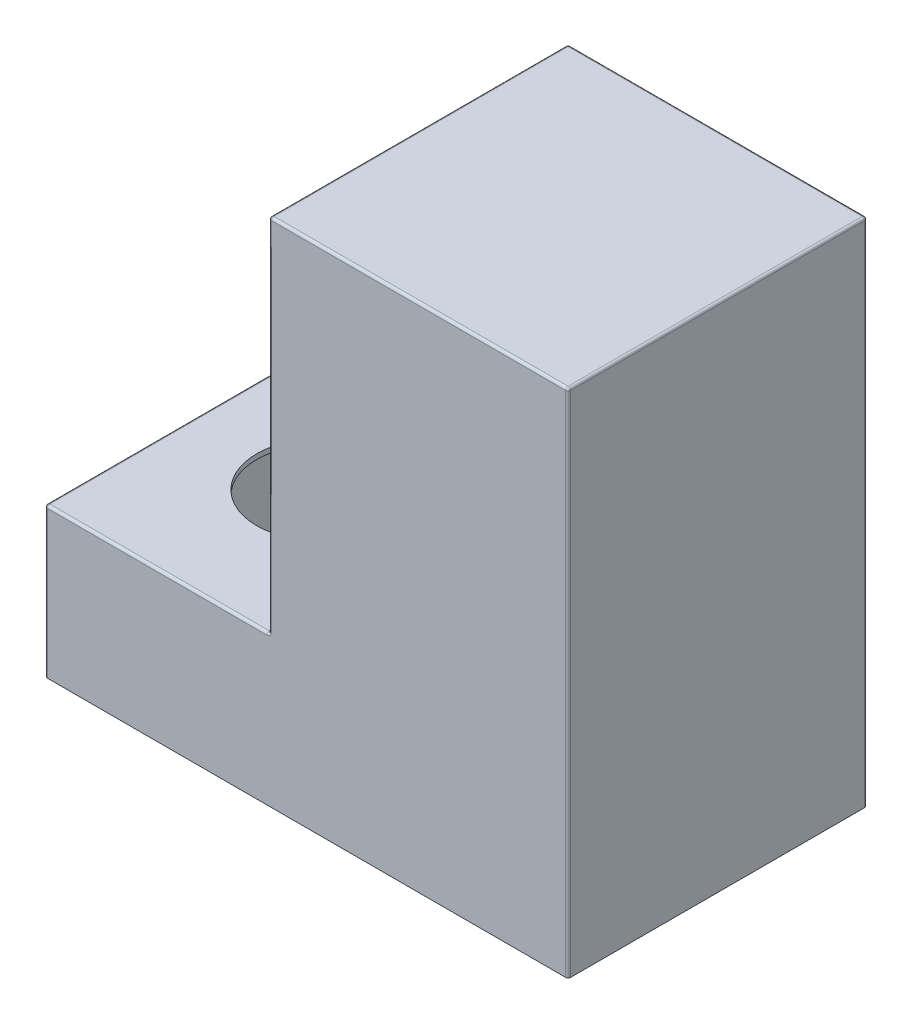
ISO-10303-21;
HEADER;
FILE_DESCRIPTION(('STEP AP214'),'2;1');
FILE_NAME('part.step','',(''),(''),'','','');
FILE_SCHEMA(('AUTOMOTIVE_DESIGN { 1 0 10303 214 1 1 1 1 }'));
ENDSEC;
DATA;
#1=APPLICATION_CONTEXT('core data for automotive mechanical design processes');
#2=APPLICATION_PROTOCOL_DEFINITION('international standard','automotive_design',2000,#1);
#3=PRODUCT_CONTEXT('',#1,'mechanical');
#4=PRODUCT('Part','Part','',(#3));
#5=PRODUCT_RELATED_PRODUCT_CATEGORY('part','',(#4));
#6=PRODUCT_DEFINITION_FORMATION('','',#4);
#7=PRODUCT_DEFINITION_CONTEXT('part definition',#1,'design');
#8=PRODUCT_DEFINITION('design','',#6,#7);
#9=PRODUCT_DEFINITION_SHAPE('','',#8);
#10=(LENGTH_UNIT() NAMED_UNIT(*) SI_UNIT(.MILLI.,.METRE.));
#11=(NAMED_UNIT(*) PLANE_ANGLE_UNIT() SI_UNIT($,.RADIAN.));
#12=(NAMED_UNIT(*) SI_UNIT($,.STERADIAN.) SOLID_ANGLE_UNIT());
#13=UNCERTAINTY_MEASURE_WITH_UNIT(LENGTH_MEASURE(1.E-05),#10,'distance_accuracy_value','');
#14=(GEOMETRIC_REPRESENTATION_CONTEXT(3) GLOBAL_UNCERTAINTY_ASSIGNED_CONTEXT((#13)) GLOBAL_UNIT_ASSIGNED_CONTEXT((#10,
#11,#12)) REPRESENTATION_CONTEXT('',''));
#15=CARTESIAN_POINT('',(0.,0.,0.));
#16=DIRECTION('',(0.,0.,1.));
#17=DIRECTION('',(1.,0.,0.));
#18=AXIS2_PLACEMENT_3D('',#15,#16,#17);
#19=CARTESIAN_POINT('',(-13.,100.5,2.));
#20=DIRECTION('',(-1.,0.,0.));
#21=DIRECTION('',(0.,0.,1.));
#22=AXIS2_PLACEMENT_3D('',#19,#20,#21);
#23=PLANE('',#22);
#24=DIRECTION('',(0.,0.,1.));
#25=VECTOR('',#24,1.);
#26=CARTESIAN_POINT('',(-13.,-44.5,2.));
#27=LINE('',#26,#25);
#28=CARTESIAN_POINT('',(-13.,-44.5,2.));
#29=VERTEX_POINT('',#28);
#30=CARTESIAN_POINT('',(-13.,-44.4999999999999,118.));
#31=VERTEX_POINT('',#30);
#32=EDGE_CURVE('E215',#29,#31,#27,.T.);
#33=ORIENTED_EDGE('',*,*,#32,.F.);
#34=DIRECTION('',(0.,-1.,0.));
#35=VECTOR('',#34,1.);
#36=CARTESIAN_POINT('',(-13.,100.5,2.));
#37=LINE('',#36,#35);
#38=CARTESIAN_POINT('',(-13.,100.5,2.));
#39=VERTEX_POINT('',#38);
#40=EDGE_CURVE('E226',#39,#29,#37,.T.);
#41=ORIENTED_EDGE('',*,*,#40,.F.);
#42=DIRECTION('',(0.,0.,-1.));
#43=VECTOR('',#42,1.);
#44=CARTESIAN_POINT('',(-13.,100.5,2.));
#45=LINE('',#44,#43);
#46=CARTESIAN_POINT('',(-13.,100.5,118.));
#47=VERTEX_POINT('',#46);
#48=EDGE_CURVE('E623',#47,#39,#45,.T.);
#49=ORIENTED_EDGE('',*,*,#48,.F.);
#50=DIRECTION('',(0.,-1.,0.));
#51=VECTOR('',#50,1.);
#52=CARTESIAN_POINT('',(-13.,100.5,118.));
#53=LINE('',#52,#51);
#54=EDGE_CURVE('E228',#47,#31,#53,.T.);
#55=ORIENTED_EDGE('',*,*,#54,.T.);
#56=EDGE_LOOP('',(#33,#41,#49,#55));
#57=FACE_BOUND('',#56,.T.);
#58=ADVANCED_FACE('F46',(#57),#23,.F.);
#59=CARTESIAN_POINT('',(105.,-102.5,120.));
#60=DIRECTION('',(-1.,0.,0.));
#61=DIRECTION('',(0.,0.,1.));
#62=AXIS2_PLACEMENT_3D('',#59,#60,#61);
#63=PLANE('',#62);
#64=DIRECTION('',(0.,1.,0.));
#65=VECTOR('',#64,1.);
#66=CARTESIAN_POINT('',(105.,102.5,1.));
#67=LINE('',#66,#65);
#68=CARTESIAN_POINT('',(105.,-102.5,1.));
#69=VERTEX_POINT('',#68);
#70=CARTESIAN_POINT('',(105.,101.5,1.));
#71=VERTEX_POINT('',#70);
#72=EDGE_CURVE('E375',#69,#71,#67,.T.);
#73=ORIENTED_EDGE('',*,*,#72,.T.);
#74=DIRECTION('',(0.,0.,-1.));
#75=VECTOR('',#74,1.);
#76=CARTESIAN_POINT('',(105.,101.5,120.));
#77=LINE('',#76,#75);
#78=CARTESIAN_POINT('',(105.,101.5,119.));
#79=VERTEX_POINT('',#78);
#80=EDGE_CURVE('E377',#71,#79,#77,.F.);
#81=ORIENTED_EDGE('',*,*,#80,.T.);
#82=DIRECTION('',(0.,1.,0.));
#83=VECTOR('',#82,1.);
#84=CARTESIAN_POINT('',(105.,-102.5,119.));
#85=LINE('',#84,#83);
#86=CARTESIAN_POINT('',(105.,-102.5,119.));
#87=VERTEX_POINT('',#86);
#88=EDGE_CURVE('E285',#79,#87,#85,.F.);
#89=ORIENTED_EDGE('',*,*,#88,.T.);
#90=DIRECTION('',(0.,0.,-1.));
#91=VECTOR('',#90,1.);
#92=CARTESIAN_POINT('',(105.,-102.5,120.));
#93=LINE('',#92,#91);
#94=EDGE_CURVE('E262',#87,#69,#93,.T.);
#95=ORIENTED_EDGE('',*,*,#94,.T.);
#96=EDGE_LOOP('',(#73,#81,#89,#95));
#97=FACE_BOUND('',#96,.T.);
#98=ADVANCED_FACE('F496',(#97),#63,.F.);
#99=CARTESIAN_POINT('',(-105.,102.5,120.));
#100=DIRECTION('',(0.,-1.,0.));
#101=DIRECTION('',(0.,0.,-1.));
#102=AXIS2_PLACEMENT_3D('',#99,#100,#101);
#103=PLANE('',#102);
#104=DIRECTION('',(-1.,0.,0.));
#105=VECTOR('',#104,1.);
#106=CARTESIAN_POINT('',(-105.,102.5,119.));
#107=LINE('',#106,#105);
#108=CARTESIAN_POINT('',(-14.,102.5,119.));
#109=VERTEX_POINT('',#108);
#110=CARTESIAN_POINT('',(104.,102.5,119.));
#111=VERTEX_POINT('',#110);
#112=EDGE_CURVE('E295',#109,#111,#107,.F.);
#113=ORIENTED_EDGE('',*,*,#112,.T.);
#114=DIRECTION('',(0.,0.,-1.));
#115=VECTOR('',#114,1.);
#116=CARTESIAN_POINT('',(104.,102.5,120.));
#117=LINE('',#116,#115);
#118=CARTESIAN_POINT('',(104.,102.5,1.));
#119=VERTEX_POINT('',#118);
#120=EDGE_CURVE('E373',#111,#119,#117,.T.);
#121=ORIENTED_EDGE('',*,*,#120,.T.);
#122=DIRECTION('',(-1.,0.,0.));
#123=VECTOR('',#122,1.);
#124=CARTESIAN_POINT('',(-14.,102.5,1.));
#125=LINE('',#124,#123);
#126=CARTESIAN_POINT('',(-14.,102.5,1.));
#127=VERTEX_POINT('',#126);
#128=EDGE_CURVE('E371',#119,#127,#125,.T.);
#129=ORIENTED_EDGE('',*,*,#128,.T.);
#130=DIRECTION('',(0.,0.,1.));
#131=VECTOR('',#130,1.);
#132=CARTESIAN_POINT('',(-14.,102.5,120.));
#133=LINE('',#132,#131);
#134=EDGE_CURVE('E293',#127,#109,#133,.T.);
#135=ORIENTED_EDGE('',*,*,#134,.T.);
#136=EDGE_LOOP('',(#113,#121,#129,#135));
#137=FACE_BOUND('',#136,.T.);
#138=ADVANCED_FACE('F513',(#137),#103,.F.);
#139=CARTESIAN_POINT('',(-105.,-102.5,120.));
#140=DIRECTION('',(1.,0.,0.));
#141=DIRECTION('',(0.,0.,-1.));
#142=AXIS2_PLACEMENT_3D('',#139,#140,#141);
#143=PLANE('',#142);
#144=DIRECTION('',(0.,-1.,0.));
#145=VECTOR('',#144,1.);
#146=CARTESIAN_POINT('',(-105.,-102.5,119.));
#147=LINE('',#146,#145);
#148=CARTESIAN_POINT('',(-105.,-102.5,119.));
#149=VERTEX_POINT('',#148);
#150=CARTESIAN_POINT('',(-105.,-43.5,119.));
#151=VERTEX_POINT('',#150);
#152=EDGE_CURVE('E309',#149,#151,#147,.F.);
#153=ORIENTED_EDGE('',*,*,#152,.T.);
#154=DIRECTION('',(0.,0.,1.));
#155=VECTOR('',#154,1.);
#156=CARTESIAN_POINT('',(-105.,-43.5,120.));
#157=LINE('',#156,#155);
#158=CARTESIAN_POINT('',(-105.,-43.5,1.));
#159=VERTEX_POINT('',#158);
#160=EDGE_CURVE('E11',#151,#159,#157,.F.);
#161=ORIENTED_EDGE('',*,*,#160,.T.);
#162=DIRECTION('',(0.,-1.,0.));
#163=VECTOR('',#162,1.);
#164=CARTESIAN_POINT('',(-105.,-102.5,1.));
#165=LINE('',#164,#163);
#166=CARTESIAN_POINT('',(-105.,-102.5,1.));
#167=VERTEX_POINT('',#166);
#168=EDGE_CURVE('E307',#159,#167,#165,.T.);
#169=ORIENTED_EDGE('',*,*,#168,.T.);
#170=DIRECTION('',(0.,0.,-1.));
#171=VECTOR('',#170,1.);
#172=CARTESIAN_POINT('',(-105.,-102.5,120.));
#173=LINE('',#172,#171);
#174=EDGE_CURVE('E267',#149,#167,#173,.T.);
#175=ORIENTED_EDGE('',*,*,#174,.F.);
#176=EDGE_LOOP('',(#153,#161,#169,#175));
#177=FACE_BOUND('',#176,.T.);
#178=ADVANCED_FACE('F435',(#177),#143,.F.);
#179=CARTESIAN_POINT('',(-105.,-102.5,120.));
#180=DIRECTION('',(0.,1.,0.));
#181=DIRECTION('',(0.,0.,1.));
#182=AXIS2_PLACEMENT_3D('',#179,#180,#181);
#183=PLANE('',#182);
#184=DIRECTION('',(0.,0.,1.));
#185=VECTOR('',#184,1.);
#186=CARTESIAN_POINT('',(103.,-102.5,2.));
#187=LINE('',#186,#185);
#188=CARTESIAN_POINT('',(103.,-102.5,2.));
#189=VERTEX_POINT('',#188);
#190=CARTESIAN_POINT('',(103.,-102.5,118.));
#191=VERTEX_POINT('',#190);
#192=EDGE_CURVE('E229',#189,#191,#187,.T.);
#193=ORIENTED_EDGE('',*,*,#192,.F.);
#194=DIRECTION('',(1.,0.,0.));
#195=VECTOR('',#194,1.);
#196=CARTESIAN_POINT('',(-15.,-102.5,2.));
#197=LINE('',#196,#195);
#198=CARTESIAN_POINT('',(-103.,-102.5,1.99999999999999));
#199=VERTEX_POINT('',#198);
#200=EDGE_CURVE('E247',#199,#189,#197,.T.);
#201=ORIENTED_EDGE('',*,*,#200,.F.);
#202=DIRECTION('',(0.,0.,-1.));
#203=VECTOR('',#202,1.);
#204=CARTESIAN_POINT('',(-103.,-102.5,1.99999999999999));
#205=LINE('',#204,#203);
#206=CARTESIAN_POINT('',(-103.,-102.5,118.));
#207=VERTEX_POINT('',#206);
#208=EDGE_CURVE('E251',#207,#199,#205,.T.);
#209=ORIENTED_EDGE('',*,*,#208,.F.);
#210=DIRECTION('',(-1.,0.,0.));
#211=VECTOR('',#210,1.);
#212=CARTESIAN_POINT('',(-15.,-102.5,118.));
#213=LINE('',#212,#211);
#214=EDGE_CURVE('E239',#191,#207,#213,.T.);
#215=ORIENTED_EDGE('',*,*,#214,.F.);
#216=EDGE_LOOP('',(#193,#201,#209,#215));
#217=FACE_BOUND('',#216,.T.);
#218=DIRECTION('',(1.,0.,0.));
#219=VECTOR('',#218,1.);
#220=CARTESIAN_POINT('',(-105.,-102.5,0.));
#221=LINE('',#220,#219);
#222=CARTESIAN_POINT('',(-104.,-102.5,0.));
#223=VERTEX_POINT('',#222);
#224=CARTESIAN_POINT('',(104.,-102.5,0.));
#225=VERTEX_POINT('',#224);
#226=EDGE_CURVE('E257',#223,#225,#221,.T.);
#227=ORIENTED_EDGE('',*,*,#226,.T.);
#228=CARTESIAN_POINT('',(104.,-102.5,1.));
#229=DIRECTION('',(0.,1.,0.));
#230=DIRECTION('',(0.,0.,1.));
#231=AXIS2_PLACEMENT_3D('',#228,#229,#230);
#232=CIRCLE('',#231,1.);
#233=EDGE_CURVE('E383',#225,#69,#232,.F.);
#234=ORIENTED_EDGE('',*,*,#233,.T.);
#235=ORIENTED_EDGE('',*,*,#94,.F.);
#236=CARTESIAN_POINT('',(104.,-102.5,119.));
#237=DIRECTION('',(0.,1.,0.));
#238=DIRECTION('',(0.,0.,1.));
#239=AXIS2_PLACEMENT_3D('',#236,#237,#238);
#240=CIRCLE('',#239,1.);
#241=CARTESIAN_POINT('',(104.,-102.5,120.));
#242=VERTEX_POINT('',#241);
#243=EDGE_CURVE('E291',#87,#242,#240,.F.);
#244=ORIENTED_EDGE('',*,*,#243,.T.);
#245=DIRECTION('',(1.,0.,0.));
#246=VECTOR('',#245,1.);
#247=CARTESIAN_POINT('',(-105.,-102.5,120.));
#248=LINE('',#247,#246);
#249=CARTESIAN_POINT('',(-104.,-102.5,120.));
#250=VERTEX_POINT('',#249);
#251=EDGE_CURVE('E259',#250,#242,#248,.T.);
#252=ORIENTED_EDGE('',*,*,#251,.F.);
#253=CARTESIAN_POINT('',(-104.,-102.5,119.));
#254=DIRECTION('',(0.,1.,0.));
#255=DIRECTION('',(0.,0.,1.));
#256=AXIS2_PLACEMENT_3D('',#253,#254,#255);
#257=CIRCLE('',#256,1.);
#258=EDGE_CURVE('E289',#250,#149,#257,.F.);
#259=ORIENTED_EDGE('',*,*,#258,.T.);
#260=ORIENTED_EDGE('',*,*,#174,.T.);
#261=CARTESIAN_POINT('',(-104.,-102.5,1.));
#262=DIRECTION('',(0.,1.,0.));
#263=DIRECTION('',(0.,0.,1.));
#264=AXIS2_PLACEMENT_3D('',#261,#262,#263);
#265=CIRCLE('',#264,1.);
#266=EDGE_CURVE('E287',#167,#223,#265,.F.);
#267=ORIENTED_EDGE('',*,*,#266,.T.);
#268=EDGE_LOOP('',(#227,#234,#235,#244,#252,#259,#260,#267));
#269=FACE_BOUND('',#268,.T.);
#270=ADVANCED_FACE('F432',(#217,#269),#183,.F.);
#271=CARTESIAN_POINT('',(0.,0.,120.));
#272=DIRECTION('',(0.,0.,-1.));
#273=DIRECTION('',(-1.,0.,0.));
#274=AXIS2_PLACEMENT_3D('',#271,#272,#273);
#275=PLANE('',#274);
#276=ORIENTED_EDGE('',*,*,#251,.T.);
#277=DIRECTION('',(0.,1.,0.));
#278=VECTOR('',#277,1.);
#279=CARTESIAN_POINT('',(104.,0.,120.));
#280=LINE('',#279,#278);
#281=CARTESIAN_POINT('',(104.,101.5,120.));
#282=VERTEX_POINT('',#281);
#283=EDGE_CURVE('E282',#242,#282,#280,.T.);
#284=ORIENTED_EDGE('',*,*,#283,.T.);
#285=DIRECTION('',(-1.,0.,0.));
#286=VECTOR('',#285,1.);
#287=CARTESIAN_POINT('',(0.,101.5,120.));
#288=LINE('',#287,#286);
#289=CARTESIAN_POINT('',(-14.,101.5,120.));
#290=VERTEX_POINT('',#289);
#291=EDGE_CURVE('E280',#282,#290,#288,.T.);
#292=ORIENTED_EDGE('',*,*,#291,.T.);
#293=DIRECTION('',(0.,1.,0.));
#294=VECTOR('',#293,1.);
#295=CARTESIAN_POINT('',(-14.,0.,120.));
#296=LINE('',#295,#294);
#297=CARTESIAN_POINT('',(-14.,-41.5,120.));
#298=VERTEX_POINT('',#297);
#299=EDGE_CURVE('E273',#290,#298,#296,.F.);
#300=ORIENTED_EDGE('',*,*,#299,.T.);
#301=CARTESIAN_POINT('',(-16.,-41.5,120.));
#302=DIRECTION('',(0.,0.,-1.));
#303=DIRECTION('',(-1.,0.,0.));
#304=AXIS2_PLACEMENT_3D('',#301,#302,#303);
#305=CIRCLE('',#304,2.);
#306=CARTESIAN_POINT('',(-16.,-43.5,120.));
#307=VERTEX_POINT('',#306);
#308=EDGE_CURVE('E270',#307,#298,#305,.F.);
#309=ORIENTED_EDGE('',*,*,#308,.F.);
#310=DIRECTION('',(1.,0.,0.));
#311=VECTOR('',#310,1.);
#312=CARTESIAN_POINT('',(0.,-43.5,120.));
#313=LINE('',#312,#311);
#314=CARTESIAN_POINT('',(-104.,-43.5,120.));
#315=VERTEX_POINT('',#314);
#316=EDGE_CURVE('E275',#307,#315,#313,.F.);
#317=ORIENTED_EDGE('',*,*,#316,.T.);
#318=DIRECTION('',(0.,-1.,0.));
#319=VECTOR('',#318,1.);
#320=CARTESIAN_POINT('',(-104.,0.,120.));
#321=LINE('',#320,#319);
#322=EDGE_CURVE('E278',#315,#250,#321,.T.);
#323=ORIENTED_EDGE('',*,*,#322,.T.);
#324=EDGE_LOOP('',(#276,#284,#292,#300,#309,#317,#323));
#325=FACE_BOUND('',#324,.T.);
#326=ADVANCED_FACE('F426',(#325),#275,.F.);
#327=CARTESIAN_POINT('',(0.,0.,0.));
#328=DIRECTION('',(0.,0.,-1.));
#329=DIRECTION('',(-1.,0.,0.));
#330=AXIS2_PLACEMENT_3D('',#327,#328,#329);
#331=PLANE('',#330);
#332=DIRECTION('',(0.,1.,0.));
#333=VECTOR('',#332,1.);
#334=CARTESIAN_POINT('',(-14.,102.5,0.));
#335=LINE('',#334,#333);
#336=CARTESIAN_POINT('',(-14.,-41.5,0.));
#337=VERTEX_POINT('',#336);
#338=CARTESIAN_POINT('',(-14.,101.5,0.));
#339=VERTEX_POINT('',#338);
#340=EDGE_CURVE('E325',#337,#339,#335,.T.);
#341=ORIENTED_EDGE('',*,*,#340,.T.);
#342=DIRECTION('',(-1.,0.,0.));
#343=VECTOR('',#342,1.);
#344=CARTESIAN_POINT('',(105.,101.5,0.));
#345=LINE('',#344,#343);
#346=CARTESIAN_POINT('',(104.,101.5,0.));
#347=VERTEX_POINT('',#346);
#348=EDGE_CURVE('E381',#339,#347,#345,.F.);
#349=ORIENTED_EDGE('',*,*,#348,.T.);
#350=DIRECTION('',(0.,1.,0.));
#351=VECTOR('',#350,1.);
#352=CARTESIAN_POINT('',(104.,-102.5,0.));
#353=LINE('',#352,#351);
#354=EDGE_CURVE('E379',#347,#225,#353,.F.);
#355=ORIENTED_EDGE('',*,*,#354,.T.);
#356=ORIENTED_EDGE('',*,*,#226,.F.);
#357=DIRECTION('',(0.,-1.,0.));
#358=VECTOR('',#357,1.);
#359=CARTESIAN_POINT('',(-104.,-42.5,0.));
#360=LINE('',#359,#358);
#361=CARTESIAN_POINT('',(-104.,-43.5,0.));
#362=VERTEX_POINT('',#361);
#363=EDGE_CURVE('E317',#223,#362,#360,.F.);
#364=ORIENTED_EDGE('',*,*,#363,.T.);
#365=DIRECTION('',(1.,0.,0.));
#366=VECTOR('',#365,1.);
#367=CARTESIAN_POINT('',(-15.,-43.5,0.));
#368=LINE('',#367,#366);
#369=CARTESIAN_POINT('',(-16.,-43.5,0.));
#370=VERTEX_POINT('',#369);
#371=EDGE_CURVE('E320',#362,#370,#368,.T.);
#372=ORIENTED_EDGE('',*,*,#371,.T.);
#373=CARTESIAN_POINT('',(-16.,-41.5,0.));
#374=DIRECTION('',(0.,0.,-1.));
#375=DIRECTION('',(-1.,0.,0.));
#376=AXIS2_PLACEMENT_3D('',#373,#374,#375);
#377=CIRCLE('',#376,2.);
#378=EDGE_CURVE('E322',#337,#370,#377,.T.);
#379=ORIENTED_EDGE('',*,*,#378,.F.);
#380=EDGE_LOOP('',(#341,#349,#355,#356,#364,#372,#379));
#381=FACE_BOUND('',#380,.T.);
#382=ADVANCED_FACE('F484',(#381),#331,.T.);
#383=CARTESIAN_POINT('',(-15.,102.5,0.));
#384=DIRECTION('',(1.,0.,0.));
#385=DIRECTION('',(0.,1.,0.));
#386=AXIS2_PLACEMENT_3D('',#383,#384,#385);
#387=PLANE('',#386);
#388=DIRECTION('',(0.,1.,0.));
#389=VECTOR('',#388,1.);
#390=CARTESIAN_POINT('',(-15.,102.5,119.));
#391=LINE('',#390,#389);
#392=CARTESIAN_POINT('',(-15.,-41.5,119.));
#393=VERTEX_POINT('',#392);
#394=CARTESIAN_POINT('',(-15.,101.5,119.));
#395=VERTEX_POINT('',#394);
#396=EDGE_CURVE('E302',#393,#395,#391,.T.);
#397=ORIENTED_EDGE('',*,*,#396,.T.);
#398=DIRECTION('',(0.,0.,1.));
#399=VECTOR('',#398,1.);
#400=CARTESIAN_POINT('',(-15.,101.5,0.));
#401=LINE('',#400,#399);
#402=CARTESIAN_POINT('',(-15.,101.5,1.));
#403=VERTEX_POINT('',#402);
#404=EDGE_CURVE('E304',#395,#403,#401,.F.);
#405=ORIENTED_EDGE('',*,*,#404,.T.);
#406=DIRECTION('',(0.,1.,0.));
#407=VECTOR('',#406,1.);
#408=CARTESIAN_POINT('',(-15.,-42.5,1.));
#409=LINE('',#408,#407);
#410=CARTESIAN_POINT('',(-15.,-41.5,1.));
#411=VERTEX_POINT('',#410);
#412=EDGE_CURVE('E300',#403,#411,#409,.F.);
#413=ORIENTED_EDGE('',*,*,#412,.T.);
#414=DIRECTION('',(0.,0.,1.));
#415=VECTOR('',#414,1.);
#416=CARTESIAN_POINT('',(-15.,-41.5,120.));
#417=LINE('',#416,#415);
#418=EDGE_CURVE('E298',#411,#393,#417,.T.);
#419=ORIENTED_EDGE('',*,*,#418,.T.);
#420=EDGE_LOOP('',(#397,#405,#413,#419));
#421=FACE_BOUND('',#420,.T.);
#422=ADVANCED_FACE('F466',(#421),#387,.F.);
#423=CARTESIAN_POINT('',(-105.,-42.5,0.));
#424=DIRECTION('',(0.,-1.,0.));
#425=DIRECTION('',(0.,0.,-1.));
#426=AXIS2_PLACEMENT_3D('',#423,#424,#425);
#427=PLANE('',#426);
#428=CARTESIAN_POINT('',(-55.,-42.5,60.));
#429=DIRECTION('',(0.,1.,0.));
#430=DIRECTION('',(0.,0.,1.));
#431=AXIS2_PLACEMENT_3D('',#428,#429,#430);
#432=CIRCLE('',#431,25.);
#433=CARTESIAN_POINT('',(-55.,-42.5,85.));
#434=VERTEX_POINT('',#433);
#435=EDGE_CURVE('E627',#434,#434,#432,.T.);
#436=ORIENTED_EDGE('',*,*,#435,.F.);
#437=EDGE_LOOP('',(#436));
#438=FACE_BOUND('',#437,.T.);
#439=DIRECTION('',(1.,0.,0.));
#440=VECTOR('',#439,1.);
#441=CARTESIAN_POINT('',(-105.,-42.5,1.));
#442=LINE('',#441,#440);
#443=CARTESIAN_POINT('',(-16.,-42.5,1.));
#444=VERTEX_POINT('',#443);
#445=CARTESIAN_POINT('',(-104.,-42.5,1.));
#446=VERTEX_POINT('',#445);
#447=EDGE_CURVE('E311',#444,#446,#442,.F.);
#448=ORIENTED_EDGE('',*,*,#447,.T.);
#449=DIRECTION('',(0.,0.,1.));
#450=VECTOR('',#449,1.);
#451=CARTESIAN_POINT('',(-104.,-42.5,0.));
#452=LINE('',#451,#450);
#453=CARTESIAN_POINT('',(-104.,-42.5,119.));
#454=VERTEX_POINT('',#453);
#455=EDGE_CURVE('E55',#446,#454,#452,.T.);
#456=ORIENTED_EDGE('',*,*,#455,.T.);
#457=DIRECTION('',(1.,0.,0.));
#458=VECTOR('',#457,1.);
#459=CARTESIAN_POINT('',(-105.,-42.5,119.));
#460=LINE('',#459,#458);
#461=CARTESIAN_POINT('',(-16.,-42.5,119.));
#462=VERTEX_POINT('',#461);
#463=EDGE_CURVE('E315',#454,#462,#460,.T.);
#464=ORIENTED_EDGE('',*,*,#463,.T.);
#465=DIRECTION('',(0.,0.,1.));
#466=VECTOR('',#465,1.);
#467=CARTESIAN_POINT('',(-16.,-42.5,0.));
#468=LINE('',#467,#466);
#469=EDGE_CURVE('E313',#462,#444,#468,.F.);
#470=ORIENTED_EDGE('',*,*,#469,.T.);
#471=EDGE_LOOP('',(#448,#456,#464,#470));
#472=FACE_BOUND('',#471,.T.);
#473=ADVANCED_FACE('F450',(#438,#472),#427,.F.);
#474=CARTESIAN_POINT('',(-15.,-44.5,2.));
#475=DIRECTION('',(0.,0.,-1.));
#476=DIRECTION('',(-1.,0.,0.));
#477=AXIS2_PLACEMENT_3D('',#474,#475,#476);
#478=PLANE('',#477);
#479=DIRECTION('',(1.,0.,0.));
#480=VECTOR('',#479,1.);
#481=CARTESIAN_POINT('',(-15.,-44.5,2.));
#482=LINE('',#481,#480);
#483=CARTESIAN_POINT('',(-102.,-44.5,1.99999999999999));
#484=VERTEX_POINT('',#483);
#485=EDGE_CURVE('E211',#484,#29,#482,.T.);
#486=ORIENTED_EDGE('',*,*,#485,.F.);
#487=CARTESIAN_POINT('',(-102.,-45.5,1.99999999999999));
#488=DIRECTION('',(0.,0.,-1.));
#489=DIRECTION('',(-1.,0.,0.));
#490=AXIS2_PLACEMENT_3D('',#487,#488,#489);
#491=CIRCLE('',#490,1.);
#492=CARTESIAN_POINT('',(-103.,-45.5,1.99999999999999));
#493=VERTEX_POINT('',#492);
#494=EDGE_CURVE('E329',#484,#493,#491,.F.);
#495=ORIENTED_EDGE('',*,*,#494,.T.);
#496=DIRECTION('',(0.,-1.,0.));
#497=VECTOR('',#496,1.);
#498=CARTESIAN_POINT('',(-103.,-44.5,1.99999999999999));
#499=LINE('',#498,#497);
#500=EDGE_CURVE('E255',#493,#199,#499,.T.);
#501=ORIENTED_EDGE('',*,*,#500,.T.);
#502=ORIENTED_EDGE('',*,*,#200,.T.);
#503=DIRECTION('',(0.,-1.,0.));
#504=VECTOR('',#503,1.);
#505=CARTESIAN_POINT('',(103.,100.5,2.));
#506=LINE('',#505,#504);
#507=CARTESIAN_POINT('',(103.,100.5,2.));
#508=VERTEX_POINT('',#507);
#509=EDGE_CURVE('E236',#508,#189,#506,.T.);
#510=ORIENTED_EDGE('',*,*,#509,.F.);
#511=DIRECTION('',(1.,0.,0.));
#512=VECTOR('',#511,1.);
#513=CARTESIAN_POINT('',(103.,100.5,2.));
#514=LINE('',#513,#512);
#515=EDGE_CURVE('E235',#39,#508,#514,.T.);
#516=ORIENTED_EDGE('',*,*,#515,.F.);
#517=ORIENTED_EDGE('',*,*,#40,.T.);
#518=EDGE_LOOP('',(#486,#495,#501,#502,#510,#516,#517));
#519=FACE_BOUND('',#518,.T.);
#520=ADVANCED_FACE('F233',(#519),#478,.F.);
#521=CARTESIAN_POINT('',(-103.,-44.5,1.99999999999999));
#522=DIRECTION('',(-1.,0.,0.));
#523=DIRECTION('',(0.,0.,1.));
#524=AXIS2_PLACEMENT_3D('',#521,#522,#523);
#525=PLANE('',#524);
#526=ORIENTED_EDGE('',*,*,#500,.F.);
#527=DIRECTION('',(0.,0.,-1.));
#528=VECTOR('',#527,1.);
#529=CARTESIAN_POINT('',(-103.,-45.5,1.99999999999999));
#530=LINE('',#529,#528);
#531=CARTESIAN_POINT('',(-103.,-45.5,118.));
#532=VERTEX_POINT('',#531);
#533=EDGE_CURVE('E331',#493,#532,#530,.F.);
#534=ORIENTED_EDGE('',*,*,#533,.T.);
#535=DIRECTION('',(0.,-1.,0.));
#536=VECTOR('',#535,1.);
#537=CARTESIAN_POINT('',(-103.,-44.5,118.));
#538=LINE('',#537,#536);
#539=EDGE_CURVE('E221',#532,#207,#538,.T.);
#540=ORIENTED_EDGE('',*,*,#539,.T.);
#541=ORIENTED_EDGE('',*,*,#208,.T.);
#542=EDGE_LOOP('',(#526,#534,#540,#541));
#543=FACE_BOUND('',#542,.T.);
#544=ADVANCED_FACE('F551',(#543),#525,.F.);
#545=CARTESIAN_POINT('',(-15.,-44.5,118.));
#546=DIRECTION('',(0.,0.,1.));
#547=DIRECTION('',(1.,0.,0.));
#548=AXIS2_PLACEMENT_3D('',#545,#546,#547);
#549=PLANE('',#548);
#550=ORIENTED_EDGE('',*,*,#539,.F.);
#551=CARTESIAN_POINT('',(-102.,-45.5,118.));
#552=DIRECTION('',(0.,0.,1.));
#553=DIRECTION('',(1.,0.,0.));
#554=AXIS2_PLACEMENT_3D('',#551,#552,#553);
#555=CIRCLE('',#554,1.);
#556=CARTESIAN_POINT('',(-102.,-44.5,118.));
#557=VERTEX_POINT('',#556);
#558=EDGE_CURVE('E333',#532,#557,#555,.F.);
#559=ORIENTED_EDGE('',*,*,#558,.T.);
#560=DIRECTION('',(-1.,0.,0.));
#561=VECTOR('',#560,1.);
#562=CARTESIAN_POINT('',(-15.,-44.5,118.));
#563=LINE('',#562,#561);
#564=EDGE_CURVE('E222',#31,#557,#563,.T.);
#565=ORIENTED_EDGE('',*,*,#564,.F.);
#566=ORIENTED_EDGE('',*,*,#54,.F.);
#567=DIRECTION('',(-1.,0.,0.));
#568=VECTOR('',#567,1.);
#569=CARTESIAN_POINT('',(103.,100.5,118.));
#570=LINE('',#569,#568);
#571=CARTESIAN_POINT('',(103.,100.5,118.));
#572=VERTEX_POINT('',#571);
#573=EDGE_CURVE('E619',#572,#47,#570,.T.);
#574=ORIENTED_EDGE('',*,*,#573,.F.);
#575=DIRECTION('',(0.,-1.,0.));
#576=VECTOR('',#575,1.);
#577=CARTESIAN_POINT('',(103.,100.5,118.));
#578=LINE('',#577,#576);
#579=EDGE_CURVE('E241',#572,#191,#578,.T.);
#580=ORIENTED_EDGE('',*,*,#579,.T.);
#581=ORIENTED_EDGE('',*,*,#214,.T.);
#582=EDGE_LOOP('',(#550,#559,#565,#566,#574,#580,#581));
#583=FACE_BOUND('',#582,.T.);
#584=ADVANCED_FACE('F547',(#583),#549,.F.);
#585=CARTESIAN_POINT('',(0.,-44.5,0.));
#586=DIRECTION('',(0.,-1.,0.));
#587=DIRECTION('',(0.,0.,-1.));
#588=AXIS2_PLACEMENT_3D('',#585,#586,#587);
#589=PLANE('',#588);
#590=CARTESIAN_POINT('',(-55.,-44.5,60.));
#591=DIRECTION('',(0.,-1.,0.));
#592=DIRECTION('',(0.,0.,-1.));
#593=AXIS2_PLACEMENT_3D('',#590,#591,#592);
#594=CIRCLE('',#593,25.);
#595=CARTESIAN_POINT('',(-55.,-44.5,85.));
#596=VERTEX_POINT('',#595);
#597=EDGE_CURVE('E50',#596,#596,#594,.T.);
#598=ORIENTED_EDGE('',*,*,#597,.F.);
#599=EDGE_LOOP('',(#598));
#600=FACE_BOUND('',#599,.T.);
#601=ORIENTED_EDGE('',*,*,#564,.T.);
#602=DIRECTION('',(0.,0.,-1.));
#603=VECTOR('',#602,1.);
#604=CARTESIAN_POINT('',(-102.,-44.5,0.));
#605=LINE('',#604,#603);
#606=EDGE_CURVE('E218',#557,#484,#605,.T.);
#607=ORIENTED_EDGE('',*,*,#606,.T.);
#608=ORIENTED_EDGE('',*,*,#485,.T.);
#609=ORIENTED_EDGE('',*,*,#32,.T.);
#610=EDGE_LOOP('',(#601,#607,#608,#609));
#611=FACE_BOUND('',#610,.T.);
#612=ADVANCED_FACE('F214',(#600,#611),#589,.T.);
#613=CARTESIAN_POINT('',(103.,100.5,2.));
#614=DIRECTION('',(1.,0.,0.));
#615=DIRECTION('',(0.,0.,-1.));
#616=AXIS2_PLACEMENT_3D('',#613,#614,#615);
#617=PLANE('',#616);
#618=ORIENTED_EDGE('',*,*,#192,.T.);
#619=ORIENTED_EDGE('',*,*,#579,.F.);
#620=DIRECTION('',(0.,0.,1.));
#621=VECTOR('',#620,1.);
#622=CARTESIAN_POINT('',(103.,100.5,2.));
#623=LINE('',#622,#621);
#624=EDGE_CURVE('E618',#508,#572,#623,.T.);
#625=ORIENTED_EDGE('',*,*,#624,.F.);
#626=ORIENTED_EDGE('',*,*,#509,.T.);
#627=EDGE_LOOP('',(#618,#619,#625,#626));
#628=FACE_BOUND('',#627,.T.);
#629=ADVANCED_FACE('F538',(#628),#617,.F.);
#630=CARTESIAN_POINT('',(0.,100.5,0.));
#631=DIRECTION('',(0.,-1.,0.));
#632=DIRECTION('',(0.,0.,-1.));
#633=AXIS2_PLACEMENT_3D('',#630,#631,#632);
#634=PLANE('',#633);
#635=ORIENTED_EDGE('',*,*,#624,.T.);
#636=ORIENTED_EDGE('',*,*,#573,.T.);
#637=ORIENTED_EDGE('',*,*,#48,.T.);
#638=ORIENTED_EDGE('',*,*,#515,.T.);
#639=EDGE_LOOP('',(#635,#636,#637,#638));
#640=FACE_BOUND('',#639,.T.);
#641=ADVANCED_FACE('F536',(#640),#634,.T.);
#642=CARTESIAN_POINT('',(-104.,-102.5,1.));
#643=DIRECTION('',(0.,1.,0.));
#644=DIRECTION('',(0.,0.,1.));
#645=AXIS2_PLACEMENT_3D('',#642,#643,#644);
#646=CYLINDRICAL_SURFACE('',#645,1.);
#647=ORIENTED_EDGE('',*,*,#168,.F.);
#648=CARTESIAN_POINT('',(-104.,-43.5,1.));
#649=DIRECTION('',(0.,1.,0.));
#650=DIRECTION('',(0.,0.,1.));
#651=AXIS2_PLACEMENT_3D('',#648,#649,#650);
#652=CIRCLE('',#651,1.);
#653=EDGE_CURVE('E404',#159,#362,#652,.F.);
#654=ORIENTED_EDGE('',*,*,#653,.T.);
#655=ORIENTED_EDGE('',*,*,#363,.F.);
#656=ORIENTED_EDGE('',*,*,#266,.F.);
#657=EDGE_LOOP('',(#647,#654,#655,#656));
#658=FACE_BOUND('',#657,.T.);
#659=ADVANCED_FACE('F439',(#658),#646,.T.);
#660=CARTESIAN_POINT('',(-104.,0.,119.));
#661=DIRECTION('',(0.,-1.,0.));
#662=DIRECTION('',(0.,0.,-1.));
#663=AXIS2_PLACEMENT_3D('',#660,#661,#662);
#664=CYLINDRICAL_SURFACE('',#663,1.);
#665=ORIENTED_EDGE('',*,*,#322,.F.);
#666=CARTESIAN_POINT('',(-104.,-43.5,119.));
#667=DIRECTION('',(0.,-1.,0.));
#668=DIRECTION('',(0.,0.,-1.));
#669=AXIS2_PLACEMENT_3D('',#666,#667,#668);
#670=CIRCLE('',#669,1.);
#671=EDGE_CURVE('E63',#315,#151,#670,.T.);
#672=ORIENTED_EDGE('',*,*,#671,.T.);
#673=ORIENTED_EDGE('',*,*,#152,.F.);
#674=ORIENTED_EDGE('',*,*,#258,.F.);
#675=EDGE_LOOP('',(#665,#672,#673,#674));
#676=FACE_BOUND('',#675,.T.);
#677=ADVANCED_FACE('F429',(#676),#664,.T.);
#678=CARTESIAN_POINT('',(0.,-43.5,1.));
#679=DIRECTION('',(-1.,0.,0.));
#680=DIRECTION('',(0.,0.,1.));
#681=AXIS2_PLACEMENT_3D('',#678,#679,#680);
#682=CYLINDRICAL_SURFACE('',#681,1.);
#683=ORIENTED_EDGE('',*,*,#371,.F.);
#684=CARTESIAN_POINT('',(-104.,-43.5,1.));
#685=DIRECTION('',(-1.,0.,0.));
#686=DIRECTION('',(0.,0.,1.));
#687=AXIS2_PLACEMENT_3D('',#684,#685,#686);
#688=CIRCLE('',#687,1.);
#689=EDGE_CURVE('E385',#362,#446,#688,.F.);
#690=ORIENTED_EDGE('',*,*,#689,.T.);
#691=ORIENTED_EDGE('',*,*,#447,.F.);
#692=CARTESIAN_POINT('',(-16.,-43.5,1.));
#693=DIRECTION('',(1.,0.,0.));
#694=DIRECTION('',(0.,0.,-1.));
#695=AXIS2_PLACEMENT_3D('',#692,#693,#694);
#696=CIRCLE('',#695,1.);
#697=EDGE_CURVE('E358',#370,#444,#696,.T.);
#698=ORIENTED_EDGE('',*,*,#697,.F.);
#699=EDGE_LOOP('',(#683,#690,#691,#698));
#700=FACE_BOUND('',#699,.T.);
#701=ADVANCED_FACE('F447',(#700),#682,.T.);
#702=CARTESIAN_POINT('',(-105.,-43.5,119.));
#703=DIRECTION('',(1.,0.,0.));
#704=DIRECTION('',(0.,0.,-1.));
#705=AXIS2_PLACEMENT_3D('',#702,#703,#704);
#706=CYLINDRICAL_SURFACE('',#705,1.);
#707=ORIENTED_EDGE('',*,*,#463,.F.);
#708=CARTESIAN_POINT('',(-104.,-43.5,119.));
#709=DIRECTION('',(1.,0.,0.));
#710=DIRECTION('',(0.,0.,-1.));
#711=AXIS2_PLACEMENT_3D('',#708,#709,#710);
#712=CIRCLE('',#711,1.);
#713=EDGE_CURVE('E407',#454,#315,#712,.T.);
#714=ORIENTED_EDGE('',*,*,#713,.T.);
#715=ORIENTED_EDGE('',*,*,#316,.F.);
#716=CARTESIAN_POINT('',(-16.,-43.5,119.));
#717=DIRECTION('',(1.,0.,0.));
#718=DIRECTION('',(0.,0.,-1.));
#719=AXIS2_PLACEMENT_3D('',#716,#717,#718);
#720=CIRCLE('',#719,1.);
#721=EDGE_CURVE('E355',#462,#307,#720,.T.);
#722=ORIENTED_EDGE('',*,*,#721,.F.);
#723=EDGE_LOOP('',(#707,#714,#715,#722));
#724=FACE_BOUND('',#723,.T.);
#725=ADVANCED_FACE('F423',(#724),#706,.T.);
#726=CARTESIAN_POINT('',(-16.,-41.5,0.));
#727=DIRECTION('',(0.,0.,-1.));
#728=DIRECTION('',(-1.,0.,0.));
#729=AXIS2_PLACEMENT_3D('',#726,#727,#728);
#730=CYLINDRICAL_SURFACE('',#729,1.);
#731=CARTESIAN_POINT('',(-16.,-41.5,1.));
#732=DIRECTION('',(0.,0.,-1.));
#733=DIRECTION('',(-1.,0.,0.));
#734=AXIS2_PLACEMENT_3D('',#731,#732,#733);
#735=CIRCLE('',#734,1.);
#736=EDGE_CURVE('E230',#444,#411,#735,.F.);
#737=ORIENTED_EDGE('',*,*,#736,.F.);
#738=ORIENTED_EDGE('',*,*,#469,.F.);
#739=CARTESIAN_POINT('',(-16.,-41.5,119.));
#740=DIRECTION('',(0.,0.,-1.));
#741=DIRECTION('',(-1.,0.,0.));
#742=AXIS2_PLACEMENT_3D('',#739,#740,#741);
#743=CIRCLE('',#742,1.);
#744=EDGE_CURVE('E352',#393,#462,#743,.T.);
#745=ORIENTED_EDGE('',*,*,#744,.F.);
#746=ORIENTED_EDGE('',*,*,#418,.F.);
#747=EDGE_LOOP('',(#737,#738,#745,#746));
#748=FACE_BOUND('',#747,.T.);
#749=ADVANCED_FACE('F454',(#748),#730,.F.);
#750=CARTESIAN_POINT('',(-16.,-41.5,1.));
#751=DIRECTION('',(0.,0.,-1.));
#752=DIRECTION('',(-1.,0.,0.));
#753=AXIS2_PLACEMENT_3D('',#750,#751,#752);
#754=TOROIDAL_SURFACE('',#753,2.,1.);
#755=ORIENTED_EDGE('',*,*,#697,.T.);
#756=ORIENTED_EDGE('',*,*,#736,.T.);
#757=CARTESIAN_POINT('',(-14.,-41.5,1.));
#758=DIRECTION('',(0.,-1.,0.));
#759=DIRECTION('',(0.,0.,-1.));
#760=AXIS2_PLACEMENT_3D('',#757,#758,#759);
#761=CIRCLE('',#760,1.);
#762=EDGE_CURVE('E349',#337,#411,#761,.F.);
#763=ORIENTED_EDGE('',*,*,#762,.F.);
#764=ORIENTED_EDGE('',*,*,#378,.T.);
#765=EDGE_LOOP('',(#755,#756,#763,#764));
#766=FACE_BOUND('',#765,.T.);
#767=ADVANCED_FACE('F482',(#766),#754,.T.);
#768=CARTESIAN_POINT('',(-16.,-41.5,119.));
#769=DIRECTION('',(0.,0.,-1.));
#770=DIRECTION('',(-1.,0.,0.));
#771=AXIS2_PLACEMENT_3D('',#768,#769,#770);
#772=TOROIDAL_SURFACE('',#771,2.,1.);
#773=ORIENTED_EDGE('',*,*,#721,.T.);
#774=ORIENTED_EDGE('',*,*,#308,.T.);
#775=CARTESIAN_POINT('',(-14.,-41.5,119.));
#776=DIRECTION('',(0.,-1.,0.));
#777=DIRECTION('',(0.,0.,-1.));
#778=AXIS2_PLACEMENT_3D('',#775,#776,#777);
#779=CIRCLE('',#778,1.);
#780=EDGE_CURVE('E346',#393,#298,#779,.F.);
#781=ORIENTED_EDGE('',*,*,#780,.F.);
#782=ORIENTED_EDGE('',*,*,#744,.T.);
#783=EDGE_LOOP('',(#773,#774,#781,#782));
#784=FACE_BOUND('',#783,.T.);
#785=ADVANCED_FACE('F458',(#784),#772,.T.);
#786=CARTESIAN_POINT('',(-14.,0.,1.));
#787=DIRECTION('',(0.,-1.,0.));
#788=DIRECTION('',(1.,0.,0.));
#789=AXIS2_PLACEMENT_3D('',#786,#787,#788);
#790=CYLINDRICAL_SURFACE('',#789,1.);
#791=ORIENTED_EDGE('',*,*,#412,.F.);
#792=CARTESIAN_POINT('',(-14.,101.5,1.));
#793=DIRECTION('',(0.,-1.,0.));
#794=DIRECTION('',(1.,0.,0.));
#795=AXIS2_PLACEMENT_3D('',#792,#793,#794);
#796=CIRCLE('',#795,1.);
#797=EDGE_CURVE('E369',#403,#339,#796,.T.);
#798=ORIENTED_EDGE('',*,*,#797,.T.);
#799=ORIENTED_EDGE('',*,*,#340,.F.);
#800=ORIENTED_EDGE('',*,*,#762,.T.);
#801=EDGE_LOOP('',(#791,#798,#799,#800));
#802=FACE_BOUND('',#801,.T.);
#803=ADVANCED_FACE('F478',(#802),#790,.T.);
#804=CARTESIAN_POINT('',(-14.,102.5,119.));
#805=DIRECTION('',(0.,1.,0.));
#806=DIRECTION('',(-1.,0.,0.));
#807=AXIS2_PLACEMENT_3D('',#804,#805,#806);
#808=CYLINDRICAL_SURFACE('',#807,1.);
#809=ORIENTED_EDGE('',*,*,#780,.T.);
#810=ORIENTED_EDGE('',*,*,#299,.F.);
#811=CARTESIAN_POINT('',(-14.,101.5,119.));
#812=DIRECTION('',(0.,1.,0.));
#813=DIRECTION('',(0.,0.,1.));
#814=AXIS2_PLACEMENT_3D('',#811,#812,#813);
#815=CIRCLE('',#814,1.);
#816=EDGE_CURVE('E343',#395,#290,#815,.T.);
#817=ORIENTED_EDGE('',*,*,#816,.F.);
#818=ORIENTED_EDGE('',*,*,#396,.F.);
#819=EDGE_LOOP('',(#809,#810,#817,#818));
#820=FACE_BOUND('',#819,.T.);
#821=ADVANCED_FACE('F463',(#820),#808,.T.);
#822=CARTESIAN_POINT('',(-14.,101.5,120.));
#823=DIRECTION('',(0.,0.,1.));
#824=DIRECTION('',(1.,0.,0.));
#825=AXIS2_PLACEMENT_3D('',#822,#823,#824);
#826=CYLINDRICAL_SURFACE('',#825,1.);
#827=ORIENTED_EDGE('',*,*,#134,.F.);
#828=CARTESIAN_POINT('',(-14.,101.5,1.));
#829=DIRECTION('',(0.,0.,1.));
#830=DIRECTION('',(1.,0.,0.));
#831=AXIS2_PLACEMENT_3D('',#828,#829,#830);
#832=CIRCLE('',#831,1.);
#833=EDGE_CURVE('E367',#127,#403,#832,.T.);
#834=ORIENTED_EDGE('',*,*,#833,.T.);
#835=ORIENTED_EDGE('',*,*,#404,.F.);
#836=CARTESIAN_POINT('',(-14.,101.5,119.));
#837=DIRECTION('',(0.,0.,1.));
#838=DIRECTION('',(1.,0.,0.));
#839=AXIS2_PLACEMENT_3D('',#836,#837,#838);
#840=CIRCLE('',#839,1.);
#841=EDGE_CURVE('E339',#109,#395,#840,.T.);
#842=ORIENTED_EDGE('',*,*,#841,.F.);
#843=EDGE_LOOP('',(#827,#834,#835,#842));
#844=FACE_BOUND('',#843,.T.);
#845=ADVANCED_FACE('F471',(#844),#826,.T.);
#846=CARTESIAN_POINT('',(-14.,101.5,119.));
#847=DIRECTION('',(0.,0.,1.));
#848=DIRECTION('',(1.,0.,0.));
#849=AXIS2_PLACEMENT_3D('',#846,#847,#848);
#850=SPHERICAL_SURFACE('',#849,1.);
#851=ORIENTED_EDGE('',*,*,#841,.T.);
#852=ORIENTED_EDGE('',*,*,#816,.T.);
#853=CARTESIAN_POINT('',(-14.,101.5,119.));
#854=DIRECTION('',(-1.,0.,0.));
#855=DIRECTION('',(0.,0.,1.));
#856=AXIS2_PLACEMENT_3D('',#853,#854,#855);
#857=CIRCLE('',#856,1.);
#858=EDGE_CURVE('E336',#109,#290,#857,.F.);
#859=ORIENTED_EDGE('',*,*,#858,.F.);
#860=EDGE_LOOP('',(#851,#852,#859));
#861=FACE_BOUND('',#860,.T.);
#862=ADVANCED_FACE('F508',(#861),#850,.T.);
#863=CARTESIAN_POINT('',(0.,101.5,119.));
#864=DIRECTION('',(-1.,0.,0.));
#865=DIRECTION('',(0.,0.,1.));
#866=AXIS2_PLACEMENT_3D('',#863,#864,#865);
#867=CYLINDRICAL_SURFACE('',#866,1.);
#868=ORIENTED_EDGE('',*,*,#291,.F.);
#869=CARTESIAN_POINT('',(104.,101.5,119.));
#870=DIRECTION('',(-1.,0.,0.));
#871=DIRECTION('',(0.,0.,1.));
#872=AXIS2_PLACEMENT_3D('',#869,#870,#871);
#873=CIRCLE('',#872,1.);
#874=EDGE_CURVE('E365',#282,#111,#873,.T.);
#875=ORIENTED_EDGE('',*,*,#874,.T.);
#876=ORIENTED_EDGE('',*,*,#112,.F.);
#877=ORIENTED_EDGE('',*,*,#858,.T.);
#878=EDGE_LOOP('',(#868,#875,#876,#877));
#879=FACE_BOUND('',#878,.T.);
#880=ADVANCED_FACE('F510',(#879),#867,.T.);
#881=CARTESIAN_POINT('',(104.,0.,119.));
#882=DIRECTION('',(0.,1.,0.));
#883=DIRECTION('',(0.,0.,1.));
#884=AXIS2_PLACEMENT_3D('',#881,#882,#883);
#885=CYLINDRICAL_SURFACE('',#884,1.);
#886=ORIENTED_EDGE('',*,*,#88,.F.);
#887=CARTESIAN_POINT('',(104.,101.5,119.));
#888=DIRECTION('',(0.,1.,0.));
#889=DIRECTION('',(0.,0.,1.));
#890=AXIS2_PLACEMENT_3D('',#887,#888,#889);
#891=CIRCLE('',#890,1.);
#892=EDGE_CURVE('E335',#79,#282,#891,.F.);
#893=ORIENTED_EDGE('',*,*,#892,.T.);
#894=ORIENTED_EDGE('',*,*,#283,.F.);
#895=ORIENTED_EDGE('',*,*,#243,.F.);
#896=EDGE_LOOP('',(#886,#893,#894,#895));
#897=FACE_BOUND('',#896,.T.);
#898=ADVANCED_FACE('F502',(#897),#885,.T.);
#899=CARTESIAN_POINT('',(-102.,-45.5,0.));
#900=DIRECTION('',(0.,0.,-1.));
#901=DIRECTION('',(-1.,0.,0.));
#902=AXIS2_PLACEMENT_3D('',#899,#900,#901);
#903=CYLINDRICAL_SURFACE('',#902,1.);
#904=ORIENTED_EDGE('',*,*,#558,.F.);
#905=ORIENTED_EDGE('',*,*,#533,.F.);
#906=ORIENTED_EDGE('',*,*,#494,.F.);
#907=ORIENTED_EDGE('',*,*,#606,.F.);
#908=EDGE_LOOP('',(#904,#905,#906,#907));
#909=FACE_BOUND('',#908,.T.);
#910=ADVANCED_FACE('F576',(#909),#903,.F.);
#911=CARTESIAN_POINT('',(-14.,101.5,1.));
#912=DIRECTION('',(0.,0.,1.));
#913=DIRECTION('',(1.,0.,0.));
#914=AXIS2_PLACEMENT_3D('',#911,#912,#913);
#915=SPHERICAL_SURFACE('',#914,1.);
#916=ORIENTED_EDGE('',*,*,#797,.F.);
#917=ORIENTED_EDGE('',*,*,#833,.F.);
#918=CARTESIAN_POINT('',(-14.,101.5,1.));
#919=DIRECTION('',(1.,0.,0.));
#920=DIRECTION('',(0.,0.,-1.));
#921=AXIS2_PLACEMENT_3D('',#918,#919,#920);
#922=CIRCLE('',#921,1.);
#923=EDGE_CURVE('E340',#339,#127,#922,.T.);
#924=ORIENTED_EDGE('',*,*,#923,.F.);
#925=EDGE_LOOP('',(#916,#917,#924));
#926=FACE_BOUND('',#925,.T.);
#927=ADVANCED_FACE('F601',(#926),#915,.T.);
#928=CARTESIAN_POINT('',(-105.,101.5,1.));
#929=DIRECTION('',(1.,0.,0.));
#930=DIRECTION('',(0.,0.,-1.));
#931=AXIS2_PLACEMENT_3D('',#928,#929,#930);
#932=CYLINDRICAL_SURFACE('',#931,1.);
#933=ORIENTED_EDGE('',*,*,#923,.T.);
#934=ORIENTED_EDGE('',*,*,#128,.F.);
#935=CARTESIAN_POINT('',(104.,101.5,1.));
#936=DIRECTION('',(1.,0.,0.));
#937=DIRECTION('',(0.,0.,-1.));
#938=AXIS2_PLACEMENT_3D('',#935,#936,#937);
#939=CIRCLE('',#938,1.);
#940=EDGE_CURVE('E396',#347,#119,#939,.T.);
#941=ORIENTED_EDGE('',*,*,#940,.F.);
#942=ORIENTED_EDGE('',*,*,#348,.F.);
#943=EDGE_LOOP('',(#933,#934,#941,#942));
#944=FACE_BOUND('',#943,.T.);
#945=ADVANCED_FACE('F606',(#944),#932,.T.);
#946=CARTESIAN_POINT('',(104.,-102.5,1.));
#947=DIRECTION('',(0.,-1.,0.));
#948=DIRECTION('',(0.,0.,-1.));
#949=AXIS2_PLACEMENT_3D('',#946,#947,#948);
#950=CYLINDRICAL_SURFACE('',#949,1.);
#951=ORIENTED_EDGE('',*,*,#233,.F.);
#952=ORIENTED_EDGE('',*,*,#354,.F.);
#953=CARTESIAN_POINT('',(104.,101.5,1.));
#954=DIRECTION('',(0.,1.,0.));
#955=DIRECTION('',(0.,0.,1.));
#956=AXIS2_PLACEMENT_3D('',#953,#954,#955);
#957=CIRCLE('',#956,1.);
#958=EDGE_CURVE('E393',#71,#347,#957,.T.);
#959=ORIENTED_EDGE('',*,*,#958,.F.);
#960=ORIENTED_EDGE('',*,*,#72,.F.);
#961=EDGE_LOOP('',(#951,#952,#959,#960));
#962=FACE_BOUND('',#961,.T.);
#963=ADVANCED_FACE('F491',(#962),#950,.T.);
#964=CARTESIAN_POINT('',(104.,101.5,1.));
#965=DIRECTION('',(0.,0.,1.));
#966=DIRECTION('',(1.,0.,0.));
#967=AXIS2_PLACEMENT_3D('',#964,#965,#966);
#968=SPHERICAL_SURFACE('',#967,1.);
#969=ORIENTED_EDGE('',*,*,#958,.T.);
#970=ORIENTED_EDGE('',*,*,#940,.T.);
#971=CARTESIAN_POINT('',(104.,101.5,1.));
#972=DIRECTION('',(0.,0.,-1.));
#973=DIRECTION('',(-1.,0.,0.));
#974=AXIS2_PLACEMENT_3D('',#971,#972,#973);
#975=CIRCLE('',#974,1.);
#976=EDGE_CURVE('E389',#71,#119,#975,.F.);
#977=ORIENTED_EDGE('',*,*,#976,.F.);
#978=EDGE_LOOP('',(#969,#970,#977));
#979=FACE_BOUND('',#978,.T.);
#980=ADVANCED_FACE('F525',(#979),#968,.T.);
#981=CARTESIAN_POINT('',(104.,101.5,120.));
#982=DIRECTION('',(0.,0.,-1.));
#983=DIRECTION('',(-1.,0.,0.));
#984=AXIS2_PLACEMENT_3D('',#981,#982,#983);
#985=CYLINDRICAL_SURFACE('',#984,1.);
#986=ORIENTED_EDGE('',*,*,#976,.T.);
#987=ORIENTED_EDGE('',*,*,#120,.F.);
#988=CARTESIAN_POINT('',(104.,101.5,119.));
#989=DIRECTION('',(0.,0.,1.));
#990=DIRECTION('',(1.,0.,0.));
#991=AXIS2_PLACEMENT_3D('',#988,#989,#990);
#992=CIRCLE('',#991,1.);
#993=EDGE_CURVE('E386',#79,#111,#992,.T.);
#994=ORIENTED_EDGE('',*,*,#993,.F.);
#995=ORIENTED_EDGE('',*,*,#80,.F.);
#996=EDGE_LOOP('',(#986,#987,#994,#995));
#997=FACE_BOUND('',#996,.T.);
#998=ADVANCED_FACE('F516',(#997),#985,.T.);
#999=CARTESIAN_POINT('',(104.,101.5,119.));
#1000=DIRECTION('',(0.,0.,1.));
#1001=DIRECTION('',(1.,0.,0.));
#1002=AXIS2_PLACEMENT_3D('',#999,#1000,#1001);
#1003=SPHERICAL_SURFACE('',#1002,1.);
#1004=ORIENTED_EDGE('',*,*,#993,.T.);
#1005=ORIENTED_EDGE('',*,*,#874,.F.);
#1006=ORIENTED_EDGE('',*,*,#892,.F.);
#1007=EDGE_LOOP('',(#1004,#1005,#1006));
#1008=FACE_BOUND('',#1007,.T.);
#1009=ADVANCED_FACE('F518',(#1008),#1003,.T.);
#1010=CARTESIAN_POINT('',(-104.,-43.5,119.));
#1011=DIRECTION('',(0.,0.,1.));
#1012=DIRECTION('',(1.,0.,0.));
#1013=AXIS2_PLACEMENT_3D('',#1010,#1011,#1012);
#1014=SPHERICAL_SURFACE('',#1013,1.);
#1015=ORIENTED_EDGE('',*,*,#671,.F.);
#1016=ORIENTED_EDGE('',*,*,#713,.F.);
#1017=CARTESIAN_POINT('',(-104.,-43.5,119.));
#1018=DIRECTION('',(0.,0.,-1.));
#1019=DIRECTION('',(-1.,0.,0.));
#1020=AXIS2_PLACEMENT_3D('',#1017,#1018,#1019);
#1021=CIRCLE('',#1020,1.);
#1022=EDGE_CURVE('E390',#151,#454,#1021,.T.);
#1023=ORIENTED_EDGE('',*,*,#1022,.F.);
#1024=EDGE_LOOP('',(#1015,#1016,#1023));
#1025=FACE_BOUND('',#1024,.T.);
#1026=ADVANCED_FACE('F48',(#1025),#1014,.T.);
#1027=CARTESIAN_POINT('',(-104.,-43.5,0.));
#1028=DIRECTION('',(0.,0.,1.));
#1029=DIRECTION('',(1.,0.,0.));
#1030=AXIS2_PLACEMENT_3D('',#1027,#1028,#1029);
#1031=CYLINDRICAL_SURFACE('',#1030,1.);
#1032=ORIENTED_EDGE('',*,*,#1022,.T.);
#1033=ORIENTED_EDGE('',*,*,#455,.F.);
#1034=CARTESIAN_POINT('',(-104.,-43.5,1.));
#1035=DIRECTION('',(0.,0.,-1.));
#1036=DIRECTION('',(0.,1.,0.));
#1037=AXIS2_PLACEMENT_3D('',#1034,#1035,#1036);
#1038=CIRCLE('',#1037,1.);
#1039=EDGE_CURVE('E411',#159,#446,#1038,.T.);
#1040=ORIENTED_EDGE('',*,*,#1039,.F.);
#1041=ORIENTED_EDGE('',*,*,#160,.F.);
#1042=EDGE_LOOP('',(#1032,#1033,#1040,#1041));
#1043=FACE_BOUND('',#1042,.T.);
#1044=ADVANCED_FACE('F417',(#1043),#1031,.T.);
#1045=CARTESIAN_POINT('',(-104.,-43.5,1.));
#1046=DIRECTION('',(0.,0.,1.));
#1047=DIRECTION('',(1.,0.,0.));
#1048=AXIS2_PLACEMENT_3D('',#1045,#1046,#1047);
#1049=SPHERICAL_SURFACE('',#1048,1.);
#1050=ORIENTED_EDGE('',*,*,#689,.F.);
#1051=ORIENTED_EDGE('',*,*,#653,.F.);
#1052=ORIENTED_EDGE('',*,*,#1039,.T.);
#1053=EDGE_LOOP('',(#1050,#1051,#1052));
#1054=FACE_BOUND('',#1053,.T.);
#1055=ADVANCED_FACE('F443',(#1054),#1049,.T.);
#1056=CARTESIAN_POINT('',(-55.,-100.5,60.));
#1057=DIRECTION('',(0.,1.,0.));
#1058=DIRECTION('',(0.,0.,1.));
#1059=AXIS2_PLACEMENT_3D('',#1056,#1057,#1058);
#1060=CYLINDRICAL_SURFACE('',#1059,25.);
#1061=CARTESIAN_POINT('',(-55.,-44.5,85.));
#1062=CARTESIAN_POINT('',(-55.,-44.4791666666666,85.));
#1063=CARTESIAN_POINT('',(-55.,-44.4583333333333,85.));
#1064=CARTESIAN_POINT('',(-55.,-44.4166666666666,85.));
#1065=CARTESIAN_POINT('',(-55.,-44.3958333333333,85.));
#1066=CARTESIAN_POINT('',(-55.,-44.3541666666666,85.));
#1067=CARTESIAN_POINT('',(-55.,-44.3333333333333,85.));
#1068=CARTESIAN_POINT('',(-55.,-44.2916666666666,85.));
#1069=CARTESIAN_POINT('',(-55.,-44.2708333333333,85.));
#1070=CARTESIAN_POINT('',(-55.,-44.2291666666666,85.));
#1071=CARTESIAN_POINT('',(-55.,-44.2083333333333,85.));
#1072=CARTESIAN_POINT('',(-55.,-44.1666666666666,85.));
#1073=CARTESIAN_POINT('',(-55.,-44.1458333333333,85.));
#1074=CARTESIAN_POINT('',(-55.,-44.1041666666666,85.));
#1075=CARTESIAN_POINT('',(-55.,-44.0833333333333,85.));
#1076=CARTESIAN_POINT('',(-55.,-44.0416666666666,85.));
#1077=CARTESIAN_POINT('',(-55.,-44.0208333333333,85.));
#1078=CARTESIAN_POINT('',(-55.,-43.9791666666666,85.));
#1079=CARTESIAN_POINT('',(-55.,-43.9583333333333,85.));
#1080=CARTESIAN_POINT('',(-55.,-43.9166666666667,85.));
#1081=CARTESIAN_POINT('',(-55.,-43.8958333333333,85.));
#1082=CARTESIAN_POINT('',(-55.,-43.8541666666667,85.));
#1083=CARTESIAN_POINT('',(-55.,-43.8333333333333,85.));
#1084=CARTESIAN_POINT('',(-55.,-43.7916666666667,85.));
#1085=CARTESIAN_POINT('',(-55.,-43.7708333333333,85.));
#1086=CARTESIAN_POINT('',(-55.,-43.7291666666667,85.));
#1087=CARTESIAN_POINT('',(-55.,-43.7083333333333,85.));
#1088=CARTESIAN_POINT('',(-55.,-43.6666666666667,85.));
#1089=CARTESIAN_POINT('',(-55.,-43.6458333333333,85.));
#1090=CARTESIAN_POINT('',(-55.,-43.6041666666667,85.));
#1091=CARTESIAN_POINT('',(-55.,-43.5833333333333,85.));
#1092=CARTESIAN_POINT('',(-55.,-43.5416666666667,85.));
#1093=CARTESIAN_POINT('',(-55.,-43.5208333333333,85.));
#1094=CARTESIAN_POINT('',(-55.,-43.4791666666667,85.));
#1095=CARTESIAN_POINT('',(-55.,-43.4583333333333,85.));
#1096=CARTESIAN_POINT('',(-55.,-43.4166666666667,85.));
#1097=CARTESIAN_POINT('',(-55.,-43.3958333333333,85.));
#1098=CARTESIAN_POINT('',(-55.,-43.3541666666667,85.));
#1099=CARTESIAN_POINT('',(-55.,-43.3333333333333,85.));
#1100=CARTESIAN_POINT('',(-55.,-43.2916666666667,85.));
#1101=CARTESIAN_POINT('',(-55.,-43.2708333333333,85.));
#1102=CARTESIAN_POINT('',(-55.,-43.2291666666667,85.));
#1103=CARTESIAN_POINT('',(-55.,-43.2083333333333,85.));
#1104=CARTESIAN_POINT('',(-55.,-43.1666666666667,85.));
#1105=CARTESIAN_POINT('',(-55.,-43.1458333333333,85.));
#1106=CARTESIAN_POINT('',(-55.,-43.1041666666667,85.));
#1107=CARTESIAN_POINT('',(-55.,-43.0833333333333,85.));
#1108=CARTESIAN_POINT('',(-55.,-43.0416666666667,85.));
#1109=CARTESIAN_POINT('',(-55.,-43.0208333333333,85.));
#1110=CARTESIAN_POINT('',(-55.,-42.9791666666667,85.));
#1111=CARTESIAN_POINT('',(-55.,-42.9583333333333,85.));
#1112=CARTESIAN_POINT('',(-55.,-42.9166666666667,85.));
#1113=CARTESIAN_POINT('',(-55.,-42.8958333333333,85.));
#1114=CARTESIAN_POINT('',(-55.,-42.8541666666667,85.));
#1115=CARTESIAN_POINT('',(-55.,-42.8333333333333,85.));
#1116=CARTESIAN_POINT('',(-55.,-42.7916666666667,85.));
#1117=CARTESIAN_POINT('',(-55.,-42.7708333333333,85.));
#1118=CARTESIAN_POINT('',(-55.,-42.7291666666667,85.));
#1119=CARTESIAN_POINT('',(-55.,-42.7083333333333,85.));
#1120=CARTESIAN_POINT('',(-55.,-42.6666666666667,85.));
#1121=CARTESIAN_POINT('',(-55.,-42.6458333333333,85.));
#1122=CARTESIAN_POINT('',(-55.,-42.6041666666667,85.));
#1123=CARTESIAN_POINT('',(-55.,-42.5833333333333,85.));
#1124=CARTESIAN_POINT('',(-55.,-42.5416666666667,85.));
#1125=CARTESIAN_POINT('',(-55.,-42.5208333333333,85.));
#1126=CARTESIAN_POINT('',(-55.,-42.5,85.));
#1127=B_SPLINE_CURVE_WITH_KNOTS('',3,(#1061,#1062,#1063,#1064,#1065,#1066,#1067,#1068,#1069,
#1070,#1071,#1072,#1073,#1074,#1075,#1076,#1077,#1078,#1079,#1080,#1081,#1082,#1083,#1084,#1085,
#1086,#1087,#1088,#1089,#1090,#1091,#1092,#1093,#1094,#1095,#1096,#1097,#1098,#1099,#1100,#1101,
#1102,#1103,#1104,#1105,#1106,#1107,#1108,#1109,#1110,#1111,#1112,#1113,#1114,#1115,#1116,#1117,
#1118,#1119,#1120,#1121,#1122,#1123,#1124,#1125,#1126),.UNSPECIFIED.,.F.,.F.,(4,2,2,2,2,2,2,2,2,
2,2,2,2,2,2,2,2,2,2,2,2,2,2,2,2,2,2,2,2,2,2,2,4),(0.,0.0625000000000001,0.125,0.1875,0.25,
0.3125,0.375,0.4375,0.5,0.562499999999994,0.624999999999994,0.687499999999994,0.749999999999994,
0.812499999999994,0.874999999999994,0.937499999999994,0.999999999999994,1.06249999999999,
1.12499999999999,1.18749999999999,1.24999999999999,1.31249999999999,1.37499999999999,
1.43749999999999,1.49999999999999,1.56249999999999,1.62499999999999,1.68749999999999,
1.74999999999999,1.81249999999999,1.87499999999999,1.93749999999999,1.99999999999999),.UNSPECIFIED.);
#1128=EDGE_CURVE('BSEAM636',#596,#434,#1127,.T.);
#1129=ORIENTED_EDGE('',*,*,#597,.T.);
#1130=ORIENTED_EDGE('',*,*,#435,.T.);
#1131=ORIENTED_EDGE('',*,*,#1128,.T.);
#1132=ORIENTED_EDGE('',*,*,#1128,.F.);
#1133=EDGE_LOOP('',(#1129,#1131,#1130,#1132));
#1134=FACE_BOUND('',#1133,.T.);
#1135=ADVANCED_FACE('F636',(#1134),#1060,.F.);
#1136=CLOSED_SHELL('',(#58,#98,#138,#178,#270,#326,#382,#422,#473,#520,#544,#584,#612,#629,#641,
#659,#677,#701,#725,#749,#767,#785,#803,#821,#845,#862,#880,#898,#910,#927,#945,#963,#980,#998,
#1009,#1026,#1044,#1055,#1135));
#1137=MANIFOLD_SOLID_BREP('B2',#1136);
#1138=ADVANCED_BREP_SHAPE_REPRESENTATION('',(#18,#1137),#14);
#1139=SHAPE_DEFINITION_REPRESENTATION(#9,#1138);
ENDSEC;
END-ISO-10303-21;
